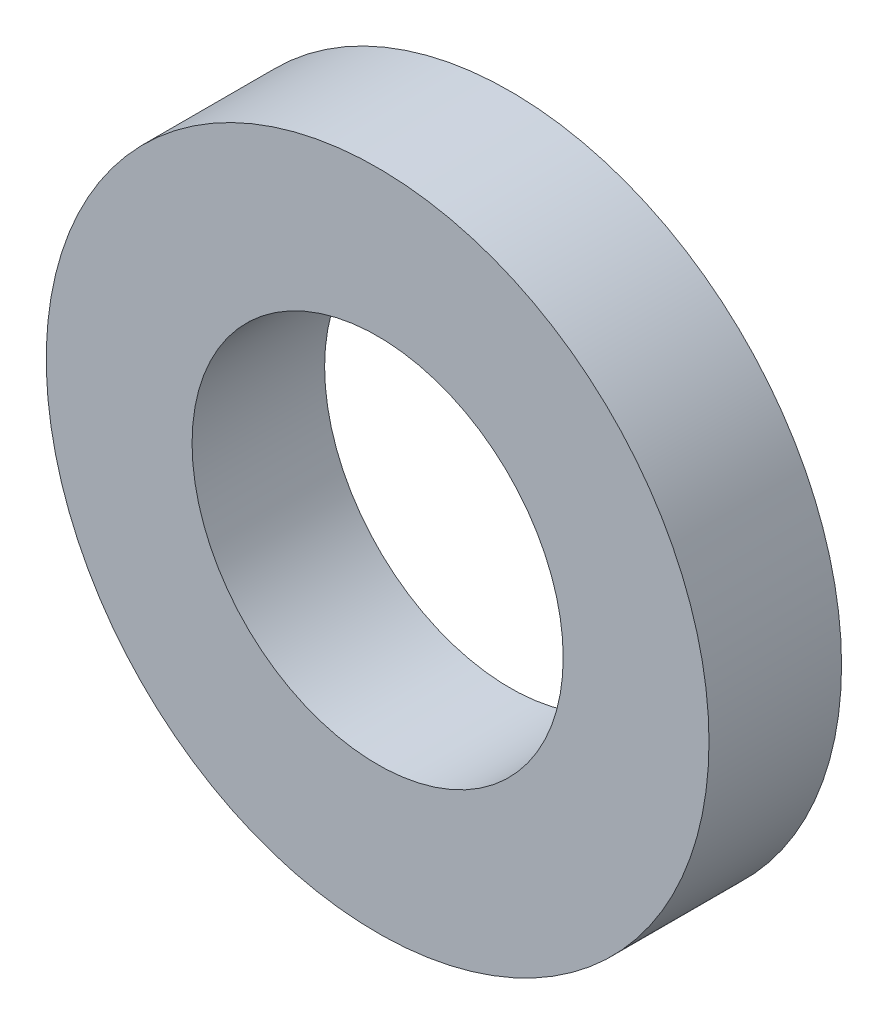
ISO-10303-21;
HEADER;
FILE_DESCRIPTION(('STEP AP214'),'2;1');
FILE_NAME('part.step','',(''),(''),'','','');
FILE_SCHEMA(('AUTOMOTIVE_DESIGN { 1 0 10303 214 1 1 1 1 }'));
ENDSEC;
DATA;
#1=APPLICATION_CONTEXT('core data for automotive mechanical design processes');
#2=APPLICATION_PROTOCOL_DEFINITION('international standard','automotive_design',2000,#1);
#3=PRODUCT_CONTEXT('',#1,'mechanical');
#4=PRODUCT('Part','Part','',(#3));
#5=PRODUCT_RELATED_PRODUCT_CATEGORY('part','',(#4));
#6=PRODUCT_DEFINITION_FORMATION('','',#4);
#7=PRODUCT_DEFINITION_CONTEXT('part definition',#1,'design');
#8=PRODUCT_DEFINITION('design','',#6,#7);
#9=PRODUCT_DEFINITION_SHAPE('','',#8);
#10=(LENGTH_UNIT() NAMED_UNIT(*) SI_UNIT(.MILLI.,.METRE.));
#11=(NAMED_UNIT(*) PLANE_ANGLE_UNIT() SI_UNIT($,.RADIAN.));
#12=(NAMED_UNIT(*) SI_UNIT($,.STERADIAN.) SOLID_ANGLE_UNIT());
#13=UNCERTAINTY_MEASURE_WITH_UNIT(LENGTH_MEASURE(1.E-05),#10,'distance_accuracy_value','');
#14=(GEOMETRIC_REPRESENTATION_CONTEXT(3) GLOBAL_UNCERTAINTY_ASSIGNED_CONTEXT((#13)) GLOBAL_UNIT_ASSIGNED_CONTEXT((#10,
#11,#12)) REPRESENTATION_CONTEXT('',''));
#15=CARTESIAN_POINT('',(0.,0.,0.));
#16=DIRECTION('',(0.,0.,1.));
#17=DIRECTION('',(1.,0.,0.));
#18=AXIS2_PLACEMENT_3D('',#15,#16,#17);
#19=CARTESIAN_POINT('',(0.,0.,100.));
#20=DIRECTION('',(0.,0.,1.));
#21=DIRECTION('',(1.,0.,0.));
#22=AXIS2_PLACEMENT_3D('',#19,#20,#21);
#23=PLANE('',#22);
#24=CARTESIAN_POINT('',(0.,0.,100.));
#25=DIRECTION('',(0.,0.,1.));
#26=DIRECTION('',(1.,0.,0.));
#27=AXIS2_PLACEMENT_3D('',#24,#25,#26);
#28=CIRCLE('',#27,250.);
#29=CARTESIAN_POINT('',(250.,0.,100.));
#30=VERTEX_POINT('',#29);
#31=EDGE_CURVE('E10',#30,#30,#28,.T.);
#32=ORIENTED_EDGE('',*,*,#31,.T.);
#33=EDGE_LOOP('',(#32));
#34=FACE_BOUND('',#33,.T.);
#35=CARTESIAN_POINT('',(0.,0.,100.));
#36=DIRECTION('',(0.,0.,1.));
#37=DIRECTION('',(1.,0.,0.));
#38=AXIS2_PLACEMENT_3D('',#35,#36,#37);
#39=CIRCLE('',#38,140.);
#40=CARTESIAN_POINT('',(140.,0.,100.));
#41=VERTEX_POINT('',#40);
#42=EDGE_CURVE('E56',#41,#41,#39,.T.);
#43=ORIENTED_EDGE('',*,*,#42,.F.);
#44=EDGE_LOOP('',(#43));
#45=FACE_BOUND('',#44,.T.);
#46=ADVANCED_FACE('F43',(#34,#45),#23,.T.);
#47=CARTESIAN_POINT('',(0.,0.,0.));
#48=DIRECTION('',(0.,0.,1.));
#49=DIRECTION('',(1.,0.,0.));
#50=AXIS2_PLACEMENT_3D('',#47,#48,#49);
#51=PLANE('',#50);
#52=CARTESIAN_POINT('',(0.,0.,0.));
#53=DIRECTION('',(0.,0.,1.));
#54=DIRECTION('',(1.,0.,0.));
#55=AXIS2_PLACEMENT_3D('',#52,#53,#54);
#56=CIRCLE('',#55,250.);
#57=CARTESIAN_POINT('',(250.,0.,0.));
#58=VERTEX_POINT('',#57);
#59=EDGE_CURVE('E47',#58,#58,#56,.T.);
#60=ORIENTED_EDGE('',*,*,#59,.F.);
#61=EDGE_LOOP('',(#60));
#62=FACE_BOUND('',#61,.T.);
#63=CARTESIAN_POINT('',(0.,0.,0.));
#64=DIRECTION('',(0.,0.,1.));
#65=DIRECTION('',(1.,0.,0.));
#66=AXIS2_PLACEMENT_3D('',#63,#64,#65);
#67=CIRCLE('',#66,140.);
#68=CARTESIAN_POINT('',(140.,0.,0.));
#69=VERTEX_POINT('',#68);
#70=EDGE_CURVE('E58',#69,#69,#67,.T.);
#71=ORIENTED_EDGE('',*,*,#70,.T.);
#72=EDGE_LOOP('',(#71));
#73=FACE_BOUND('',#72,.T.);
#74=ADVANCED_FACE('F70',(#62,#73),#51,.F.);
#75=CARTESIAN_POINT('',(0.,0.,100.));
#76=DIRECTION('',(0.,0.,-1.));
#77=DIRECTION('',(-1.,0.,0.));
#78=AXIS2_PLACEMENT_3D('',#75,#76,#77);
#79=CYLINDRICAL_SURFACE('',#78,250.);
#80=ORIENTED_EDGE('',*,*,#31,.F.);
#81=EDGE_LOOP('',(#80));
#82=FACE_BOUND('',#81,.T.);
#83=ORIENTED_EDGE('',*,*,#59,.T.);
#84=EDGE_LOOP('',(#83));
#85=FACE_BOUND('',#84,.T.);
#86=ADVANCED_FACE('F45',(#82,#85),#79,.T.);
#87=CARTESIAN_POINT('',(0.,0.,100.));
#88=DIRECTION('',(0.,0.,-1.));
#89=DIRECTION('',(-1.,0.,0.));
#90=AXIS2_PLACEMENT_3D('',#87,#88,#89);
#91=CYLINDRICAL_SURFACE('',#90,140.);
#92=ORIENTED_EDGE('',*,*,#42,.T.);
#93=EDGE_LOOP('',(#92));
#94=FACE_BOUND('',#93,.T.);
#95=ORIENTED_EDGE('',*,*,#70,.F.);
#96=EDGE_LOOP('',(#95));
#97=FACE_BOUND('',#96,.T.);
#98=ADVANCED_FACE('F66',(#94,#97),#91,.F.);
#99=CLOSED_SHELL('',(#46,#74,#86,#98));
#100=MANIFOLD_SOLID_BREP('B2',#99);
#101=ADVANCED_BREP_SHAPE_REPRESENTATION('',(#18,#100),#14);
#102=SHAPE_DEFINITION_REPRESENTATION(#9,#101);
ENDSEC;
END-ISO-10303-21;
